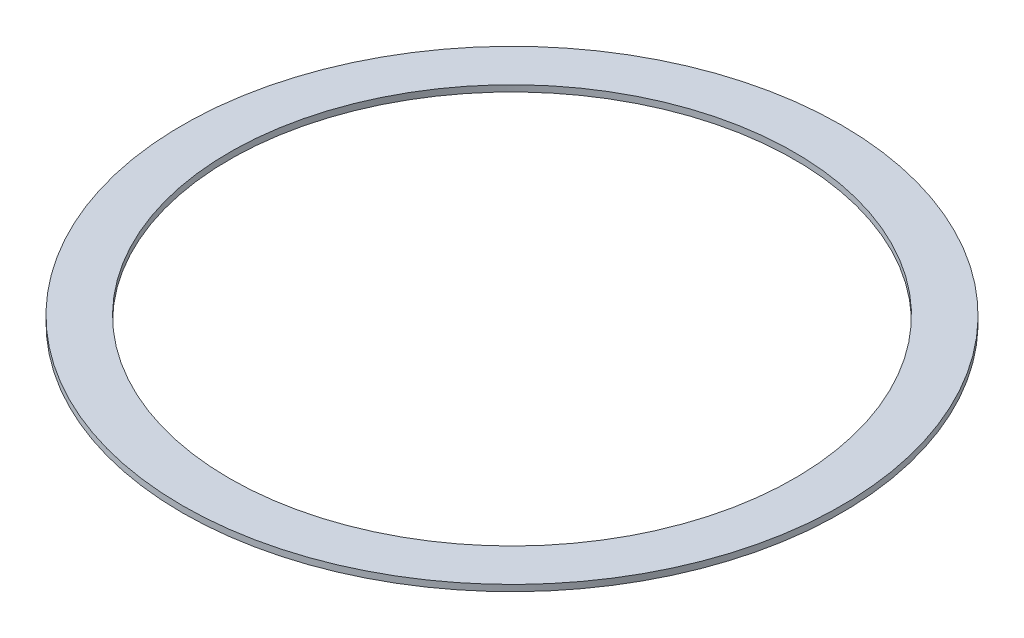
ISO-10303-21;
HEADER;
FILE_DESCRIPTION(('STEP AP214'),'2;1');
FILE_NAME('part.step','',(''),(''),'','','');
FILE_SCHEMA(('AUTOMOTIVE_DESIGN { 1 0 10303 214 1 1 1 1 }'));
ENDSEC;
DATA;
#1=APPLICATION_CONTEXT('core data for automotive mechanical design processes');
#2=APPLICATION_PROTOCOL_DEFINITION('international standard','automotive_design',2000,#1);
#3=PRODUCT_CONTEXT('',#1,'mechanical');
#4=PRODUCT('Part','Part','',(#3));
#5=PRODUCT_RELATED_PRODUCT_CATEGORY('part','',(#4));
#6=PRODUCT_DEFINITION_FORMATION('','',#4);
#7=PRODUCT_DEFINITION_CONTEXT('part definition',#1,'design');
#8=PRODUCT_DEFINITION('design','',#6,#7);
#9=PRODUCT_DEFINITION_SHAPE('','',#8);
#10=(LENGTH_UNIT() NAMED_UNIT(*) SI_UNIT(.MILLI.,.METRE.));
#11=(NAMED_UNIT(*) PLANE_ANGLE_UNIT() SI_UNIT($,.RADIAN.));
#12=(NAMED_UNIT(*) SI_UNIT($,.STERADIAN.) SOLID_ANGLE_UNIT());
#13=UNCERTAINTY_MEASURE_WITH_UNIT(LENGTH_MEASURE(1.E-05),#10,'distance_accuracy_value','');
#14=(GEOMETRIC_REPRESENTATION_CONTEXT(3) GLOBAL_UNCERTAINTY_ASSIGNED_CONTEXT((#13)) GLOBAL_UNIT_ASSIGNED_CONTEXT((#10,
#11,#12)) REPRESENTATION_CONTEXT('',''));
#15=CARTESIAN_POINT('',(0.,0.,0.));
#16=DIRECTION('',(0.,0.,1.));
#17=DIRECTION('',(1.,0.,0.));
#18=AXIS2_PLACEMENT_3D('',#15,#16,#17);
#19=CARTESIAN_POINT('',(0.,1.,0.));
#20=DIRECTION('',(0.,1.,0.));
#21=DIRECTION('',(0.,0.,1.));
#22=AXIS2_PLACEMENT_3D('',#19,#20,#21);
#23=PLANE('',#22);
#24=CARTESIAN_POINT('',(0.,1.,0.));
#25=DIRECTION('',(0.,1.,0.));
#26=DIRECTION('',(0.,0.,1.));
#27=AXIS2_PLACEMENT_3D('',#24,#25,#26);
#28=CIRCLE('',#27,52.5);
#29=CARTESIAN_POINT('',(0.,1.,52.5));
#30=VERTEX_POINT('',#29);
#31=EDGE_CURVE('E10',#30,#30,#28,.T.);
#32=ORIENTED_EDGE('',*,*,#31,.T.);
#33=EDGE_LOOP('',(#32));
#34=FACE_BOUND('',#33,.T.);
#35=CARTESIAN_POINT('',(0.,1.,0.));
#36=DIRECTION('',(0.,1.,0.));
#37=DIRECTION('',(0.,0.,1.));
#38=AXIS2_PLACEMENT_3D('',#35,#36,#37);
#39=CIRCLE('',#38,45.);
#40=CARTESIAN_POINT('',(0.,1.,45.));
#41=VERTEX_POINT('',#40);
#42=EDGE_CURVE('E42',#41,#41,#39,.T.);
#43=ORIENTED_EDGE('',*,*,#42,.F.);
#44=EDGE_LOOP('',(#43));
#45=FACE_BOUND('',#44,.T.);
#46=ADVANCED_FACE('F31',(#34,#45),#23,.T.);
#47=CARTESIAN_POINT('',(0.,0.,0.));
#48=DIRECTION('',(0.,1.,0.));
#49=DIRECTION('',(0.,0.,1.));
#50=AXIS2_PLACEMENT_3D('',#47,#48,#49);
#51=PLANE('',#50);
#52=CARTESIAN_POINT('',(0.,0.,0.));
#53=DIRECTION('',(0.,1.,0.));
#54=DIRECTION('',(0.,0.,1.));
#55=AXIS2_PLACEMENT_3D('',#52,#53,#54);
#56=CIRCLE('',#55,52.5);
#57=CARTESIAN_POINT('',(0.,0.,52.5));
#58=VERTEX_POINT('',#57);
#59=EDGE_CURVE('E35',#58,#58,#56,.T.);
#60=ORIENTED_EDGE('',*,*,#59,.F.);
#61=EDGE_LOOP('',(#60));
#62=FACE_BOUND('',#61,.T.);
#63=CARTESIAN_POINT('',(0.,0.,0.));
#64=DIRECTION('',(0.,1.,0.));
#65=DIRECTION('',(0.,0.,1.));
#66=AXIS2_PLACEMENT_3D('',#63,#64,#65);
#67=CIRCLE('',#66,45.);
#68=CARTESIAN_POINT('',(0.,0.,45.));
#69=VERTEX_POINT('',#68);
#70=EDGE_CURVE('E44',#69,#69,#67,.T.);
#71=ORIENTED_EDGE('',*,*,#70,.T.);
#72=EDGE_LOOP('',(#71));
#73=FACE_BOUND('',#72,.T.);
#74=ADVANCED_FACE('F54',(#62,#73),#51,.F.);
#75=CARTESIAN_POINT('',(0.,1.,0.));
#76=DIRECTION('',(0.,-1.,0.));
#77=DIRECTION('',(0.,0.,-1.));
#78=AXIS2_PLACEMENT_3D('',#75,#76,#77);
#79=CYLINDRICAL_SURFACE('',#78,52.5);
#80=ORIENTED_EDGE('',*,*,#31,.F.);
#81=EDGE_LOOP('',(#80));
#82=FACE_BOUND('',#81,.T.);
#83=ORIENTED_EDGE('',*,*,#59,.T.);
#84=EDGE_LOOP('',(#83));
#85=FACE_BOUND('',#84,.T.);
#86=ADVANCED_FACE('F33',(#82,#85),#79,.T.);
#87=CARTESIAN_POINT('',(0.,1.,0.));
#88=DIRECTION('',(0.,-1.,0.));
#89=DIRECTION('',(0.,0.,-1.));
#90=AXIS2_PLACEMENT_3D('',#87,#88,#89);
#91=CYLINDRICAL_SURFACE('',#90,45.);
#92=ORIENTED_EDGE('',*,*,#42,.T.);
#93=EDGE_LOOP('',(#92));
#94=FACE_BOUND('',#93,.T.);
#95=ORIENTED_EDGE('',*,*,#70,.F.);
#96=EDGE_LOOP('',(#95));
#97=FACE_BOUND('',#96,.T.);
#98=ADVANCED_FACE('F50',(#94,#97),#91,.F.);
#99=CLOSED_SHELL('',(#46,#74,#86,#98));
#100=MANIFOLD_SOLID_BREP('B2',#99);
#101=ADVANCED_BREP_SHAPE_REPRESENTATION('',(#18,#100),#14);
#102=SHAPE_DEFINITION_REPRESENTATION(#9,#101);
ENDSEC;
END-ISO-10303-21;
